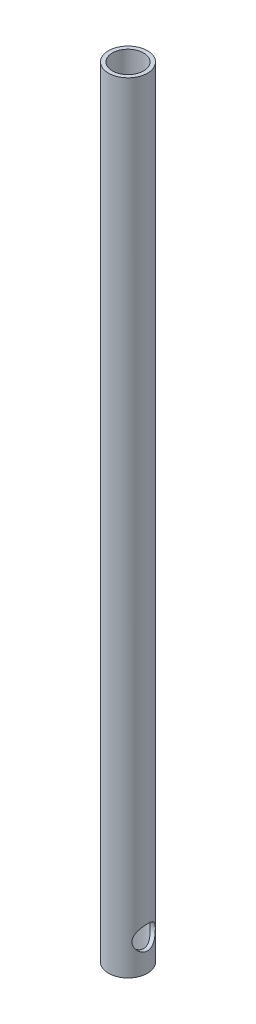
ISO-10303-21;
HEADER;
FILE_DESCRIPTION(('STEP AP214'),'2;1');
FILE_NAME('part.step','',(''),(''),'','','');
FILE_SCHEMA(('AUTOMOTIVE_DESIGN { 1 0 10303 214 1 1 1 1 }'));
ENDSEC;
DATA;
#1=APPLICATION_CONTEXT('core data for automotive mechanical design processes');
#2=APPLICATION_PROTOCOL_DEFINITION('international standard','automotive_design',2000,#1);
#3=PRODUCT_CONTEXT('',#1,'mechanical');
#4=PRODUCT('Part','Part','',(#3));
#5=PRODUCT_RELATED_PRODUCT_CATEGORY('part','',(#4));
#6=PRODUCT_DEFINITION_FORMATION('','',#4);
#7=PRODUCT_DEFINITION_CONTEXT('part definition',#1,'design');
#8=PRODUCT_DEFINITION('design','',#6,#7);
#9=PRODUCT_DEFINITION_SHAPE('','',#8);
#10=(LENGTH_UNIT() NAMED_UNIT(*) SI_UNIT(.MILLI.,.METRE.));
#11=(NAMED_UNIT(*) PLANE_ANGLE_UNIT() SI_UNIT($,.RADIAN.));
#12=(NAMED_UNIT(*) SI_UNIT($,.STERADIAN.) SOLID_ANGLE_UNIT());
#13=UNCERTAINTY_MEASURE_WITH_UNIT(LENGTH_MEASURE(1.E-05),#10,'distance_accuracy_value','');
#14=(GEOMETRIC_REPRESENTATION_CONTEXT(3) GLOBAL_UNCERTAINTY_ASSIGNED_CONTEXT((#13)) GLOBAL_UNIT_ASSIGNED_CONTEXT((#10,
#11,#12)) REPRESENTATION_CONTEXT('',''));
#15=CARTESIAN_POINT('',(0.,0.,0.));
#16=DIRECTION('',(0.,0.,1.));
#17=DIRECTION('',(1.,0.,0.));
#18=AXIS2_PLACEMENT_3D('',#15,#16,#17);
#19=CARTESIAN_POINT('',(0.,100.,0.));
#20=DIRECTION('',(0.,-1.,0.));
#21=DIRECTION('',(0.,0.,-1.));
#22=AXIS2_PLACEMENT_3D('',#19,#20,#21);
#23=CYLINDRICAL_SURFACE('',#22,2.5);
#24=CARTESIAN_POINT('',(0.,100.,0.));
#25=DIRECTION('',(0.,1.,0.));
#26=DIRECTION('',(0.,0.,1.));
#27=AXIS2_PLACEMENT_3D('',#24,#25,#26);
#28=CIRCLE('',#27,2.5);
#29=CARTESIAN_POINT('',(0.,100.,2.5));
#30=VERTEX_POINT('',#29);
#31=EDGE_CURVE('E10',#30,#30,#28,.T.);
#32=ORIENTED_EDGE('',*,*,#31,.F.);
#33=EDGE_LOOP('',(#32));
#34=FACE_BOUND('',#33,.T.);
#35=CARTESIAN_POINT('',(0.,0.,0.));
#36=DIRECTION('',(0.,1.,0.));
#37=DIRECTION('',(0.,0.,1.));
#38=AXIS2_PLACEMENT_3D('',#35,#36,#37);
#39=CIRCLE('',#38,2.5);
#40=CARTESIAN_POINT('',(0.,0.,2.5));
#41=VERTEX_POINT('',#40);
#42=EDGE_CURVE('E53',#41,#41,#39,.T.);
#43=ORIENTED_EDGE('',*,*,#42,.T.);
#44=EDGE_LOOP('',(#43));
#45=FACE_BOUND('',#44,.T.);
#46=CARTESIAN_POINT('',(-2.,4.,1.5));
#47=CARTESIAN_POINT('',(-1.99999416642511,4.07547897528964,1.50000404108592));
#48=CARTESIAN_POINT('',(-2.00433633903481,4.1509384340798,1.49426852824014));
#49=CARTESIAN_POINT('',(-2.02092590613883,4.29932390396222,1.47174965152787));
#50=CARTESIAN_POINT('',(-2.03318155043097,4.3722471873851,1.45495475788936));
#51=CARTESIAN_POINT('',(-2.0636233903473,4.51308364167728,1.41143486335795));
#52=CARTESIAN_POINT('',(-2.08176666183119,4.58102883803527,1.3847815450315));
#53=CARTESIAN_POINT('',(-2.12185904995836,4.71143745336792,1.32252909283019));
#54=CARTESIAN_POINT('',(-2.14380930122416,4.77389922969514,1.28692729054693));
#55=CARTESIAN_POINT('',(-2.19228594587542,4.89994901666408,1.20271292747644));
#56=CARTESIAN_POINT('',(-2.21904371037662,4.96274095712394,1.15304179435289));
#57=CARTESIAN_POINT('',(-2.2722622943106,5.07976476274175,1.04426801309985));
#58=CARTESIAN_POINT('',(-2.29872287517103,5.1339901516708,0.985158296729613));
#59=CARTESIAN_POINT('',(-2.35175567858734,5.2381338097097,0.851442367411702));
#60=CARTESIAN_POINT('',(-2.37803133577818,5.28695446366975,0.775851995162548));
#61=CARTESIAN_POINT('',(-2.42443786983179,5.37080972244443,0.615654228271658));
#62=CARTESIAN_POINT('',(-2.44457437988735,5.40585697412271,0.53105519662633));
#63=CARTESIAN_POINT('',(-2.4747098780044,5.45759592281265,0.363771406742666));
#64=CARTESIAN_POINT('',(-2.4854930393917,5.4757203609673,0.281674698130915));
#65=CARTESIAN_POINT('',(-2.49874939277545,5.49794280286312,0.114970509382708));
#66=CARTESIAN_POINT('',(-2.50123038813307,5.50205397800006,0.0303654624001535));
#67=CARTESIAN_POINT('',(-2.49783372711539,5.49638625265754,-0.12763728373731));
#68=CARTESIAN_POINT('',(-2.49295437513726,5.48826647383069,-0.201123832865635));
#69=CARTESIAN_POINT('',(-2.47707997553857,5.46152020435189,-0.345464269151768));
#70=CARTESIAN_POINT('',(-2.46608447529309,5.44289293609285,-0.416317961051202));
#71=CARTESIAN_POINT('',(-2.43884907201719,5.39583443729622,-0.554056780469079));
#72=CARTESIAN_POINT('',(-2.42257910450824,5.367346938861,-0.620916491037617));
#73=CARTESIAN_POINT('',(-2.38609637638748,5.30161538377446,-0.74898866011561));
#74=CARTESIAN_POINT('',(-2.36588259201812,5.26436905294099,-0.810199646208011));
#75=CARTESIAN_POINT('',(-2.32037925976363,5.17716090719555,-0.933074267143199));
#76=CARTESIAN_POINT('',(-2.2947718295215,5.12621168826426,-0.993918663198193));
#77=CARTESIAN_POINT('',(-2.24255554245601,5.01559588213983,-1.10671465909275));
#78=CARTESIAN_POINT('',(-2.21594536703375,4.95591749652549,-1.1586540130834));
#79=CARTESIAN_POINT('',(-2.16111075123946,4.82134659383645,-1.25824837767417));
#80=CARTESIAN_POINT('',(-2.13305661385124,4.74549242346054,-1.30470933188632));
#81=CARTESIAN_POINT('',(-2.08250879557267,4.58529376836339,-1.38397217194232));
#82=CARTESIAN_POINT('',(-2.0600049029882,4.50096528387436,-1.41679921962189));
#83=CARTESIAN_POINT('',(-2.02895865196731,4.34760636810465,-1.46077497064842));
#84=CARTESIAN_POINT('',(-2.01833888618315,4.27995936770336,-1.47527903312665));
#85=CARTESIAN_POINT('',(-2.00392150777558,4.14262638970052,-1.49480872755284));
#86=CARTESIAN_POINT('',(-2.00011596115116,4.07294287951544,-1.49984538302907));
#87=CARTESIAN_POINT('',(-1.99988914321323,3.93344831756429,-1.50014781114183));
#88=CARTESIAN_POINT('',(-2.00347810223984,3.86363722278479,-1.49540004697659));
#89=CARTESIAN_POINT('',(-2.01751520788652,3.72601265625144,-1.47640290574941));
#90=CARTESIAN_POINT('',(-2.02796877613213,3.65820080775975,-1.46214601830139));
#91=CARTESIAN_POINT('',(-2.054317683331,3.52628542052022,-1.42488312618657));
#92=CARTESIAN_POINT('',(-2.07020622092812,3.46217736346777,-1.40188805257362));
#93=CARTESIAN_POINT('',(-2.10571539417587,3.33852228426982,-1.34796261057072));
#94=CARTESIAN_POINT('',(-2.12533743689999,3.278976993634,-1.31702924888212));
#95=CARTESIAN_POINT('',(-2.17036819177736,3.15475991748776,-1.24167439558512));
#96=CARTESIAN_POINT('',(-2.19618239397369,3.09109916490343,-1.19582663060303));
#97=CARTESIAN_POINT('',(-2.2482175480362,2.97171451515054,-1.09487395518701));
#98=CARTESIAN_POINT('',(-2.27443886711455,2.91599830783089,-1.03976018672402));
#99=CARTESIAN_POINT('',(-2.32835625910913,2.80677599264957,-0.913274837212769));
#100=CARTESIAN_POINT('',(-2.3558007587587,2.75449927339416,-0.840721108780194));
#101=CARTESIAN_POINT('',(-2.40537639133459,2.66309722316335,-0.686103100868023));
#102=CARTESIAN_POINT('',(-2.4275110444941,2.62396317215908,-0.604045176134705));
#103=CARTESIAN_POINT('',(-2.46252280092775,2.56313179656863,-0.438840232972141));
#104=CARTESIAN_POINT('',(-2.47595588067329,2.54037377220889,-0.356205963651261));
#105=CARTESIAN_POINT('',(-2.494407389061,2.50928539715374,-0.18738306389086));
#106=CARTESIAN_POINT('',(-2.49943534582737,2.50093870928238,-0.101198571781971));
#107=CARTESIAN_POINT('',(-2.50040600461976,2.49932539141407,0.0598120232009817));
#108=CARTESIAN_POINT('',(-2.49747057186327,2.50419666543697,0.134620583589704));
#109=CARTESIAN_POINT('',(-2.48512948412095,2.52489382438161,0.282148755978772));
#110=CARTESIAN_POINT('',(-2.47572375706639,2.5407198313216,0.354868344701912));
#111=CARTESIAN_POINT('',(-2.45149427526962,2.58221957158378,0.495145481978795));
#112=CARTESIAN_POINT('',(-2.43675966858906,2.60773159612924,0.562767032608828));
#113=CARTESIAN_POINT('',(-2.40303337447155,2.66764059455475,0.692781971999982));
#114=CARTESIAN_POINT('',(-2.38404073252268,2.7020395608596,0.75517418419983));
#115=CARTESIAN_POINT('',(-2.34093432659381,2.78292519656876,0.880263645295945));
#116=CARTESIAN_POINT('',(-2.31648844639149,2.83031870901687,0.942258690439938));
#117=CARTESIAN_POINT('',(-2.26601907350661,2.93375303371772,1.05789751536306));
#118=CARTESIAN_POINT('',(-2.23999385274509,2.98980342560791,1.11153190956915));
#119=CARTESIAN_POINT('',(-2.18528165666204,3.1172855621777,1.2159097535057));
#120=CARTESIAN_POINT('',(-2.15667566270901,3.1897664861655,1.26542406663367));
#121=CARTESIAN_POINT('',(-2.10376464485145,3.34348485276654,1.35156817210325));
#122=CARTESIAN_POINT('',(-2.07945738811052,3.42471771398141,1.38820466322661));
#123=CARTESIAN_POINT('',(-2.0408000304796,3.5870642851372,1.44437116535132));
#124=CARTESIAN_POINT('',(-2.02577665830138,3.66759523596124,1.46509526060187));
#125=CARTESIAN_POINT('',(-2.00539032320036,3.83209739470368,1.49289268240426));
#126=CARTESIAN_POINT('',(-2.00000648744643,3.91606076575871,1.49999550595837));
#127=CARTESIAN_POINT('',(-2.,4.,1.5));
#128=B_SPLINE_CURVE_WITH_KNOTS('',3,(#46,#47,#48,#49,#50,#51,#52,#53,#54,#55,#56,#57,#58,#59,
#60,#61,#62,#63,#64,#65,#66,#67,#68,#69,#70,#71,#72,#73,#74,#75,#76,#77,#78,#79,#80,#81,#82,#83,
#84,#85,#86,#87,#88,#89,#90,#91,#92,#93,#94,#95,#96,#97,#98,#99,#100,#101,#102,#103,#104,#105,
#106,#107,#108,#109,#110,#111,#112,#113,#114,#115,#116,#117,#118,#119,#120,#121,#122,#123,#124,
#125,#126,#127),.UNSPECIFIED.,.T.,.F.,(4,2,2,2,2,2,2,2,2,2,2,2,2,2,2,2,2,2,2,2,2,2,2,2,2,2,2,2,
2,2,2,2,2,2,2,2,2,2,2,2,4),(0.,0.226085249493392,0.45240657433077,0.677113624991876,
0.901887762215932,1.15414462390001,1.40659128601844,1.68630157736223,1.9657544327122,
2.21853330858497,2.47107452602766,2.69230130543182,2.91354445887944,3.13607155036377,
3.35865648368878,3.60782810055849,3.85733966656908,4.13576671140276,4.41367760154768,
4.62276298054684,4.83160475643976,5.04073566011181,5.25003193304128,5.45906724365495,
5.6681814915466,5.91499438482002,6.16204457978454,6.44121828011588,6.72020638384847,
6.97891479383337,7.23732973022726,7.46129321849399,7.68525920139648,7.90563970188756,
8.12606965394584,8.37042963549487,8.61506198741954,8.89071695766603,9.16622832484805,
9.41820120134354,9.66962780912277),.UNSPECIFIED.);
#129=CARTESIAN_POINT('',(-2.,4.,1.5));
#130=VERTEX_POINT('',#129);
#131=EDGE_CURVE('E83',#130,#130,#128,.T.);
#132=ORIENTED_EDGE('',*,*,#131,.F.);
#133=EDGE_LOOP('',(#132));
#134=FACE_BOUND('',#133,.T.);
#135=CARTESIAN_POINT('',(2.,4.,1.5));
#136=CARTESIAN_POINT('',(1.99999416642511,3.92452102471036,1.50000404108592));
#137=CARTESIAN_POINT('',(2.00433633903481,3.8490615659202,1.49426852824013));
#138=CARTESIAN_POINT('',(2.02092590613883,3.70067609603778,1.47174965152787));
#139=CARTESIAN_POINT('',(2.03318155043097,3.6277528126149,1.45495475788936));
#140=CARTESIAN_POINT('',(2.0636233903473,3.48691635832272,1.41143486335795));
#141=CARTESIAN_POINT('',(2.08176666183119,3.41897116196473,1.3847815450315));
#142=CARTESIAN_POINT('',(2.12185904995836,3.28856254663208,1.32252909283019));
#143=CARTESIAN_POINT('',(2.14380930122416,3.22610077030486,1.28692729054693));
#144=CARTESIAN_POINT('',(2.19228594587542,3.10005098333592,1.20271292747644));
#145=CARTESIAN_POINT('',(2.21904371037662,3.03725904287606,1.15304179435289));
#146=CARTESIAN_POINT('',(2.27226229431061,2.92023523725825,1.04426801309985));
#147=CARTESIAN_POINT('',(2.29872287517103,2.8660098483292,0.985158296729613));
#148=CARTESIAN_POINT('',(2.35175567858734,2.7618661902903,0.851442367411701));
#149=CARTESIAN_POINT('',(2.37803133577818,2.71304553633025,0.775851995162548));
#150=CARTESIAN_POINT('',(2.42443786983179,2.62919027755557,0.615654228271658));
#151=CARTESIAN_POINT('',(2.44457437988735,2.59414302587729,0.53105519662633));
#152=CARTESIAN_POINT('',(2.4747098780044,2.54240407718735,0.363771406742666));
#153=CARTESIAN_POINT('',(2.4854930393917,2.5242796390327,0.281674698130915));
#154=CARTESIAN_POINT('',(2.49874939277545,2.50205719713688,0.114970509382708));
#155=CARTESIAN_POINT('',(2.50123038813307,2.49794602199995,0.0303654624001528));
#156=CARTESIAN_POINT('',(2.49783372711539,2.50361374734246,-0.12763728373731));
#157=CARTESIAN_POINT('',(2.49295437513726,2.51173352616931,-0.201123832865635));
#158=CARTESIAN_POINT('',(2.47707997553857,2.53847979564811,-0.345464269151768));
#159=CARTESIAN_POINT('',(2.46608447529309,2.55710706390716,-0.416317961051202));
#160=CARTESIAN_POINT('',(2.43884907201719,2.60416556270378,-0.55405678046908));
#161=CARTESIAN_POINT('',(2.42257910450824,2.632653061139,-0.620916491037618));
#162=CARTESIAN_POINT('',(2.38609637638748,2.69838461622554,-0.748988660115612));
#163=CARTESIAN_POINT('',(2.36588259201812,2.73563094705901,-0.810199646208012));
#164=CARTESIAN_POINT('',(2.32037925976362,2.82283909280445,-0.9330742671432));
#165=CARTESIAN_POINT('',(2.2947718295215,2.87378831173574,-0.993918663198194));
#166=CARTESIAN_POINT('',(2.24255554245601,2.98440411786018,-1.10671465909275));
#167=CARTESIAN_POINT('',(2.21594536703375,3.04408250347451,-1.1586540130834));
#168=CARTESIAN_POINT('',(2.16111075123946,3.17865340616355,-1.25824837767417));
#169=CARTESIAN_POINT('',(2.13305661385124,3.25450757653946,-1.30470933188632));
#170=CARTESIAN_POINT('',(2.08250879557267,3.41470623163661,-1.38397217194232));
#171=CARTESIAN_POINT('',(2.0600049029882,3.49903471612564,-1.41679921962189));
#172=CARTESIAN_POINT('',(2.02895865196731,3.65239363189535,-1.46077497064842));
#173=CARTESIAN_POINT('',(2.01833888618315,3.72004063229664,-1.47527903312665));
#174=CARTESIAN_POINT('',(2.00392150777558,3.85737361029948,-1.49480872755284));
#175=CARTESIAN_POINT('',(2.00011596115116,3.92705712048456,-1.49984538302907));
#176=CARTESIAN_POINT('',(1.99988914321323,4.06655168243571,-1.50014781114183));
#177=CARTESIAN_POINT('',(2.00347810223984,4.13636277721521,-1.49540004697659));
#178=CARTESIAN_POINT('',(2.01751520788652,4.27398734374856,-1.47640290574941));
#179=CARTESIAN_POINT('',(2.02796877613213,4.34179919224025,-1.46214601830139));
#180=CARTESIAN_POINT('',(2.054317683331,4.47371457947979,-1.42488312618657));
#181=CARTESIAN_POINT('',(2.07020622092812,4.53782263653223,-1.40188805257362));
#182=CARTESIAN_POINT('',(2.10571539417587,4.66147771573018,-1.34796261057072));
#183=CARTESIAN_POINT('',(2.12533743689999,4.721023006366,-1.31702924888212));
#184=CARTESIAN_POINT('',(2.17036819177736,4.84524008251225,-1.24167439558512));
#185=CARTESIAN_POINT('',(2.19618239397369,4.90890083509657,-1.19582663060303));
#186=CARTESIAN_POINT('',(2.2482175480362,5.02828548484946,-1.09487395518701));
#187=CARTESIAN_POINT('',(2.27443886711455,5.08400169216912,-1.03976018672402));
#188=CARTESIAN_POINT('',(2.32835625910913,5.19322400735043,-0.913274837212767));
#189=CARTESIAN_POINT('',(2.3558007587587,5.24550072660584,-0.840721108780192));
#190=CARTESIAN_POINT('',(2.40537639133459,5.33690277683665,-0.68610310086802));
#191=CARTESIAN_POINT('',(2.4275110444941,5.37603682784092,-0.604045176134704));
#192=CARTESIAN_POINT('',(2.46252280092775,5.43686820343137,-0.43884023297214));
#193=CARTESIAN_POINT('',(2.47595588067329,5.45962622779111,-0.356205963651259));
#194=CARTESIAN_POINT('',(2.494407389061,5.49071460284626,-0.187383063890858));
#195=CARTESIAN_POINT('',(2.49943534582737,5.49906129071762,-0.101198571781969));
#196=CARTESIAN_POINT('',(2.50040600461976,5.50067460858593,0.0598120232009833));
#197=CARTESIAN_POINT('',(2.49747057186327,5.49580333456303,0.134620583589705));
#198=CARTESIAN_POINT('',(2.48512948412095,5.47510617561839,0.282148755978773));
#199=CARTESIAN_POINT('',(2.47572375706639,5.4592801686784,0.354868344701913));
#200=CARTESIAN_POINT('',(2.45149427526962,5.41778042841621,0.495145481978796));
#201=CARTESIAN_POINT('',(2.43675966858906,5.39226840387076,0.562767032608829));
#202=CARTESIAN_POINT('',(2.40303337447155,5.33235940544525,0.692781971999983));
#203=CARTESIAN_POINT('',(2.38404073252268,5.2979604391404,0.755174184199831));
#204=CARTESIAN_POINT('',(2.3409343265938,5.21707480343124,0.880263645295947));
#205=CARTESIAN_POINT('',(2.31648844639149,5.16968129098313,0.942258690439939));
#206=CARTESIAN_POINT('',(2.26601907350661,5.06624696628228,1.05789751536307));
#207=CARTESIAN_POINT('',(2.23999385274509,5.01019657439209,1.11153190956916));
#208=CARTESIAN_POINT('',(2.18528165666204,4.8827144378223,1.2159097535057));
#209=CARTESIAN_POINT('',(2.15667566270901,4.8102335138345,1.26542406663367));
#210=CARTESIAN_POINT('',(2.10376464485145,4.65651514723346,1.35156817210325));
#211=CARTESIAN_POINT('',(2.07945738811052,4.57528228601859,1.38820466322661));
#212=CARTESIAN_POINT('',(2.0408000304796,4.4129357148628,1.44437116535132));
#213=CARTESIAN_POINT('',(2.02577665830138,4.33240476403875,1.46509526060187));
#214=CARTESIAN_POINT('',(2.00539032320036,4.16790260529632,1.49289268240426));
#215=CARTESIAN_POINT('',(2.00000648744643,4.08393923424129,1.49999550595837));
#216=CARTESIAN_POINT('',(2.,4.,1.5));
#217=B_SPLINE_CURVE_WITH_KNOTS('',3,(#135,#136,#137,#138,#139,#140,#141,#142,#143,#144,#145,
#146,#147,#148,#149,#150,#151,#152,#153,#154,#155,#156,#157,#158,#159,#160,#161,#162,#163,#164,
#165,#166,#167,#168,#169,#170,#171,#172,#173,#174,#175,#176,#177,#178,#179,#180,#181,#182,#183,
#184,#185,#186,#187,#188,#189,#190,#191,#192,#193,#194,#195,#196,#197,#198,#199,#200,#201,#202,
#203,#204,#205,#206,#207,#208,#209,#210,#211,#212,#213,#214,#215,#216),.UNSPECIFIED.,.T.,.F.,(4,
2,2,2,2,2,2,2,2,2,2,2,2,2,2,2,2,2,2,2,2,2,2,2,2,2,2,2,2,2,2,2,2,2,2,2,2,2,2,2,4),(0.,
0.226085249493392,0.45240657433077,0.677113624991876,0.901887762215933,1.15414462390001,
1.40659128601844,1.68630157736223,1.9657544327122,2.21853330858497,2.47107452602767,
2.69230130543182,2.91354445887945,3.13607155036377,3.35865648368878,3.60782810055849,
3.85733966656908,4.13576671140276,4.41367760154768,4.62276298054684,4.83160475643976,
5.04073566011181,5.25003193304128,5.45906724365495,5.66818149154661,5.91499438482002,
6.16204457978454,6.44121828011588,6.72020638384847,6.97891479383337,7.23732973022726,
7.46129321849399,7.68525920139648,7.90563970188756,8.12606965394584,8.37042963549487,
8.61506198741955,8.89071695766604,9.16622832484805,9.41820120134354,9.66962780912277),.UNSPECIFIED.);
#218=CARTESIAN_POINT('',(2.,4.,1.5));
#219=VERTEX_POINT('',#218);
#220=EDGE_CURVE('E89',#219,#219,#217,.T.);
#221=ORIENTED_EDGE('',*,*,#220,.F.);
#222=EDGE_LOOP('',(#221));
#223=FACE_BOUND('',#222,.T.);
#224=ADVANCED_FACE('F39',(#34,#45,#134,#223),#23,.T.);
#225=CARTESIAN_POINT('',(0.,100.,0.));
#226=DIRECTION('',(0.,-1.,0.));
#227=DIRECTION('',(0.,0.,-1.));
#228=AXIS2_PLACEMENT_3D('',#225,#226,#227);
#229=CYLINDRICAL_SURFACE('',#228,2.);
#230=CARTESIAN_POINT('',(-1.32287565553229,4.,1.5));
#231=CARTESIAN_POINT('',(-1.32289190044095,4.06999742342563,1.49999219049447));
#232=CARTESIAN_POINT('',(-1.32856366615417,4.14004583431192,1.4950410907442));
#233=CARTESIAN_POINT('',(-1.34990644032801,4.27732985620948,1.47578333210409));
#234=CARTESIAN_POINT('',(-1.3656072516867,4.34455644501951,1.46144878565587));
#235=CARTESIAN_POINT('',(-1.4037512791687,4.47357984673838,1.42483838991846));
#236=CARTESIAN_POINT('',(-1.42609848244814,4.53543877676246,1.40267483444956));
#237=CARTESIAN_POINT('',(-1.47486455031267,4.65434545444519,1.35130655299363));
#238=CARTESIAN_POINT('',(-1.50128292264932,4.71139378246922,1.3221026780169));
#239=CARTESIAN_POINT('',(-1.56177312961147,4.83211279631659,1.25039909811054));
#240=CARTESIAN_POINT('',(-1.59628904009787,4.89466793422648,1.20639573950363));
#241=CARTESIAN_POINT('',(-1.66521164096378,5.01252546624227,1.10933596759308));
#242=CARTESIAN_POINT('',(-1.69961809339876,5.06781696482027,1.05626622282799));
#243=CARTESIAN_POINT('',(-1.77262582436251,5.18085873865547,0.929610192252514));
#244=CARTESIAN_POINT('',(-1.81064921229759,5.23680596671985,0.854047289142163));
#245=CARTESIAN_POINT('',(-1.87882809751632,5.33462220828283,0.69118971482194));
#246=CARTESIAN_POINT('',(-1.90900204180106,5.37652429746881,0.603923293836167));
#247=CARTESIAN_POINT('',(-1.95034258990248,5.43320768590294,0.447869023983645));
#248=CARTESIAN_POINT('',(-1.96449710921006,5.45235709597847,0.381446049692536));
#249=CARTESIAN_POINT('',(-1.98605635937555,5.48139011599675,0.245552609316542));
#250=CARTESIAN_POINT('',(-1.99346695432364,5.49128177610674,0.176084845995169));
#251=CARTESIAN_POINT('',(-2.00091375578087,5.50122173386249,0.0358650926220278));
#252=CARTESIAN_POINT('',(-2.00093080057495,5.50124445437644,-0.0348897591186389));
#253=CARTESIAN_POINT('',(-1.99354206503066,5.49138206321971,-0.175316156674036));
#254=CARTESIAN_POINT('',(-1.98613456571337,5.48149465709186,-0.244987447822227));
#255=CARTESIAN_POINT('',(-1.96491377944411,5.45291894941013,-0.378889193792651));
#256=CARTESIAN_POINT('',(-1.9513285776568,5.43454367361293,-0.443224268236295));
#257=CARTESIAN_POINT('',(-1.91882278657017,5.39000435781776,-0.567680485046397));
#258=CARTESIAN_POINT('',(-1.89990103394193,5.36383861948684,-0.627800705033636));
#259=CARTESIAN_POINT('',(-1.85561045984504,5.30147038485469,-0.74921692186473));
#260=CARTESIAN_POINT('',(-1.82976540608097,5.26448790338124,-0.809935384713599));
#261=CARTESIAN_POINT('',(-1.77460702483739,5.18326629602949,-0.924567250548284));
#262=CARTESIAN_POINT('',(-1.74529074780453,5.1390209863001,-0.978474784621221));
#263=CARTESIAN_POINT('',(-1.6789376587236,5.03477665117906,-1.08908204283329));
#264=CARTESIAN_POINT('',(-1.64151655866368,4.9733907899736,-1.14424493004784));
#265=CARTESIAN_POINT('',(-1.5672595828377,4.84216541637806,-1.24400875556228));
#266=CARTESIAN_POINT('',(-1.53042399363524,4.77232190047494,-1.28860466211477));
#267=CARTESIAN_POINT('',(-1.46819425999159,4.63901812975437,-1.358732064116));
#268=CARTESIAN_POINT('',(-1.44197599789983,4.57701295469935,-1.38628866868102));
#269=CARTESIAN_POINT('',(-1.39536741257394,4.44793471858062,-1.43319397108784));
#270=CARTESIAN_POINT('',(-1.37496395320511,4.38087352030963,-1.45256121808259));
#271=CARTESIAN_POINT('',(-1.34640050620232,4.25631305600168,-1.47902385350669));
#272=CARTESIAN_POINT('',(-1.3366153955687,4.19955291788314,-1.48779069496582));
#273=CARTESIAN_POINT('',(-1.32435588438334,4.08464453382618,-1.49871760619789));
#274=CARTESIAN_POINT('',(-1.32187213058307,4.02649816009718,-1.50088612873265));
#275=CARTESIAN_POINT('',(-1.32462868790497,3.9105210082666,-1.49845270115552));
#276=CARTESIAN_POINT('',(-1.32987184207164,3.85269035419033,-1.4938482589949));
#277=CARTESIAN_POINT('',(-1.34721218775046,3.73892384755713,-1.47822527271969));
#278=CARTESIAN_POINT('',(-1.35932107727345,3.6829914020519,-1.46719578056394));
#279=CARTESIAN_POINT('',(-1.39427758287802,3.55366195506113,-1.43413959562387));
#280=CARTESIAN_POINT('',(-1.41944823697315,3.48156404608497,-1.40954189769242));
#281=CARTESIAN_POINT('',(-1.47537861079975,3.34369233635989,-1.35088877838435));
#282=CARTESIAN_POINT('',(-1.5061485847723,3.27793048270525,-1.31681594335477));
#283=CARTESIAN_POINT('',(-1.5710828237565,3.15065099195188,-1.23869774116696));
#284=CARTESIAN_POINT('',(-1.60532883846046,3.08936712378175,-1.19434110060341));
#285=CARTESIAN_POINT('',(-1.67347506272361,2.97399790363875,-1.09682562914592));
#286=CARTESIAN_POINT('',(-1.70737509574665,2.91991607201106,-1.04366252194463));
#287=CARTESIAN_POINT('',(-1.77960222623532,2.80872300837064,-0.916234513829622));
#288=CARTESIAN_POINT('',(-1.81728174165357,2.7535247611424,-0.839896270946857));
#289=CARTESIAN_POINT('',(-1.88453104769825,2.65737926654913,-0.675551612651268));
#290=CARTESIAN_POINT('',(-1.91411836052283,2.61640117541871,-0.587571029974852));
#291=CARTESIAN_POINT('',(-1.95419406402379,2.56156200855313,-0.430755661496912));
#292=CARTESIAN_POINT('',(-1.9677547802964,2.54324320672456,-0.364250057327473));
#293=CARTESIAN_POINT('',(-1.98810265589123,2.51587120369248,-0.228364464964353));
#294=CARTESIAN_POINT('',(-1.9948958710696,2.50680971845149,-0.158987104561944));
#295=CARTESIAN_POINT('',(-2.00113566717062,2.4984836090714,-0.0191476059403998));
#296=CARTESIAN_POINT('',(-2.00056500218907,2.49924198265175,0.0513166925870866));
#297=CARTESIAN_POINT('',(-1.9920880324381,2.51056099130124,0.19100901103008));
#298=CARTESIAN_POINT('',(-1.98417977344351,2.52112423770748,0.260236696591288));
#299=CARTESIAN_POINT('',(-1.96203400925195,2.55097491616724,0.393521935254971));
#300=CARTESIAN_POINT('',(-1.94798690792879,2.57000018132155,0.457671236511441));
#301=CARTESIAN_POINT('',(-1.91462720575136,2.61578806561894,0.581661343097388));
#302=CARTESIAN_POINT('',(-1.89531347862386,2.64255233983091,0.641501223388814));
#303=CARTESIAN_POINT('',(-1.8501764221064,2.70627793759597,0.762547698766811));
#304=CARTESIAN_POINT('',(-1.82386352707581,2.74405093135959,0.823141236713417));
#305=CARTESIAN_POINT('',(-1.76785506075717,2.82686644055421,0.937414811724213));
#306=CARTESIAN_POINT('',(-1.73815638795658,2.87191563728605,0.991088412383372));
#307=CARTESIAN_POINT('',(-1.67106353042106,2.97800536656079,1.10112380660681));
#308=CARTESIAN_POINT('',(-1.63330922504697,3.0404463994399,1.15591691541995));
#309=CARTESIAN_POINT('',(-1.55866082463332,3.17386807189987,1.2547525342935));
#310=CARTESIAN_POINT('',(-1.52176704921892,3.24485182603656,1.29879110556728));
#311=CARTESIAN_POINT('',(-1.46049601449284,3.37888325059031,1.36695971301455));
#312=CARTESIAN_POINT('',(-1.43513625007637,3.44033498270656,1.39333526337998));
#313=CARTESIAN_POINT('',(-1.39032564651233,3.56808291305588,1.43805398028599));
#314=CARTESIAN_POINT('',(-1.37085915899696,3.63436569159545,1.45641847678344));
#315=CARTESIAN_POINT('',(-1.34532423383262,3.75078821959693,1.4799705775638));
#316=CARTESIAN_POINT('',(-1.33700130265679,3.79996707129046,1.48744249026867));
#317=CARTESIAN_POINT('',(-1.32577295392455,3.89942233303365,1.49745839072448));
#318=CARTESIAN_POINT('',(-1.32286398151145,3.94969800094373,1.50000561211714));
#319=CARTESIAN_POINT('',(-1.32287565553229,4.,1.5));
#320=B_SPLINE_CURVE_WITH_KNOTS('',3,(#230,#231,#232,#233,#234,#235,#236,#237,#238,#239,#240,
#241,#242,#243,#244,#245,#246,#247,#248,#249,#250,#251,#252,#253,#254,#255,#256,#257,#258,#259,
#260,#261,#262,#263,#264,#265,#266,#267,#268,#269,#270,#271,#272,#273,#274,#275,#276,#277,#278,
#279,#280,#281,#282,#283,#284,#285,#286,#287,#288,#289,#290,#291,#292,#293,#294,#295,#296,#297,
#298,#299,#300,#301,#302,#303,#304,#305,#306,#307,#308,#309,#310,#311,#312,#313,#314,#315,#316,
#317,#318,#319),.UNSPECIFIED.,.T.,.F.,(4,2,2,2,2,2,2,2,2,2,2,2,2,2,2,2,2,2,2,2,2,2,2,2,2,2,2,2,
2,2,2,2,2,2,2,2,2,2,2,2,2,2,2,2,4),(0.,0.20973177668449,0.420089722582994,0.627545385620138,
0.834975984672344,1.08585208691169,1.33710031031849,1.63964848103538,1.94147907444963,
2.15227725277555,2.36289195870711,2.57405250727807,2.78526195641288,2.9892375589505,
3.19325766108669,3.41936844116895,3.64567274887663,3.91649517204702,4.18744629647933,
4.40499409477196,4.62204646613006,4.79608005545901,4.96989060538193,5.14376512326213,
5.31793678696019,5.55730028202397,5.79710662639151,6.0454320909006,6.29387849446618,
6.59652499511463,6.89851088586565,7.10852896194427,7.3183589353918,7.52868041101043,
7.73905791773945,7.94332812691912,8.14764205379332,8.3751005248961,8.60276905744644,
8.87547580578155,9.14828228208531,9.36218279640835,9.57551025772699,9.72632812073766,
9.87704692032409),.UNSPECIFIED.);
#321=CARTESIAN_POINT('',(-1.32287565553229,4.,1.5));
#322=VERTEX_POINT('',#321);
#323=EDGE_CURVE('E64',#322,#322,#320,.T.);
#324=ORIENTED_EDGE('',*,*,#323,.T.);
#325=EDGE_LOOP('',(#324));
#326=FACE_BOUND('',#325,.T.);
#327=CARTESIAN_POINT('',(0.,100.,0.));
#328=DIRECTION('',(0.,1.,0.));
#329=DIRECTION('',(0.,0.,1.));
#330=AXIS2_PLACEMENT_3D('',#327,#328,#329);
#331=CIRCLE('',#330,2.);
#332=CARTESIAN_POINT('',(0.,100.,2.));
#333=VERTEX_POINT('',#332);
#334=EDGE_CURVE('E59',#333,#333,#331,.T.);
#335=ORIENTED_EDGE('',*,*,#334,.T.);
#336=EDGE_LOOP('',(#335));
#337=FACE_BOUND('',#336,.T.);
#338=CARTESIAN_POINT('',(0.,0.,0.));
#339=DIRECTION('',(0.,1.,0.));
#340=DIRECTION('',(0.,0.,1.));
#341=AXIS2_PLACEMENT_3D('',#338,#339,#340);
#342=CIRCLE('',#341,2.);
#343=CARTESIAN_POINT('',(0.,0.,2.));
#344=VERTEX_POINT('',#343);
#345=EDGE_CURVE('E62',#344,#344,#342,.T.);
#346=ORIENTED_EDGE('',*,*,#345,.F.);
#347=EDGE_LOOP('',(#346));
#348=FACE_BOUND('',#347,.T.);
#349=CARTESIAN_POINT('',(1.32287565553229,4.,1.5));
#350=CARTESIAN_POINT('',(1.32289190044095,3.93000257657437,1.49999219049447));
#351=CARTESIAN_POINT('',(1.32856366615417,3.85995416568808,1.4950410907442));
#352=CARTESIAN_POINT('',(1.34990644032801,3.72267014379052,1.47578333210409));
#353=CARTESIAN_POINT('',(1.3656072516867,3.65544355498049,1.46144878565587));
#354=CARTESIAN_POINT('',(1.4037512791687,3.52642015326162,1.42483838991846));
#355=CARTESIAN_POINT('',(1.42609848244814,3.46456122323754,1.40267483444956));
#356=CARTESIAN_POINT('',(1.47486455031267,3.34565454555481,1.35130655299363));
#357=CARTESIAN_POINT('',(1.50128292264932,3.28860621753078,1.3221026780169));
#358=CARTESIAN_POINT('',(1.56177312961147,3.16788720368341,1.25039909811054));
#359=CARTESIAN_POINT('',(1.59628904009787,3.10533206577352,1.20639573950363));
#360=CARTESIAN_POINT('',(1.66521164096378,2.98747453375773,1.10933596759308));
#361=CARTESIAN_POINT('',(1.69961809339876,2.93218303517973,1.05626622282799));
#362=CARTESIAN_POINT('',(1.77262582436251,2.81914126134453,0.929610192252514));
#363=CARTESIAN_POINT('',(1.81064921229759,2.76319403328014,0.854047289142163));
#364=CARTESIAN_POINT('',(1.87882809751632,2.66537779171716,0.69118971482194));
#365=CARTESIAN_POINT('',(1.90900204180106,2.62347570253119,0.603923293836167));
#366=CARTESIAN_POINT('',(1.95034258990248,2.56679231409706,0.447869023983645));
#367=CARTESIAN_POINT('',(1.96449710921006,2.54764290402153,0.381446049692536));
#368=CARTESIAN_POINT('',(1.98605635937555,2.51860988400325,0.245552609316542));
#369=CARTESIAN_POINT('',(1.99346695432364,2.50871822389326,0.176084845995169));
#370=CARTESIAN_POINT('',(2.00091375578087,2.49877826613751,0.0358650926220276));
#371=CARTESIAN_POINT('',(2.00093080057495,2.49875554562356,-0.034889759118639));
#372=CARTESIAN_POINT('',(1.99354206503066,2.50861793678029,-0.175316156674036));
#373=CARTESIAN_POINT('',(1.98613456571337,2.51850534290814,-0.244987447822227));
#374=CARTESIAN_POINT('',(1.96491377944411,2.54708105058987,-0.378889193792652));
#375=CARTESIAN_POINT('',(1.9513285776568,2.56545632638708,-0.443224268236296));
#376=CARTESIAN_POINT('',(1.91882278657017,2.60999564218224,-0.567680485046397));
#377=CARTESIAN_POINT('',(1.89990103394193,2.63616138051316,-0.627800705033636));
#378=CARTESIAN_POINT('',(1.85561045984504,2.69852961514531,-0.74921692186473));
#379=CARTESIAN_POINT('',(1.82976540608097,2.73551209661876,-0.809935384713599));
#380=CARTESIAN_POINT('',(1.77460702483739,2.81673370397051,-0.924567250548284));
#381=CARTESIAN_POINT('',(1.74529074780453,2.8609790136999,-0.978474784621221));
#382=CARTESIAN_POINT('',(1.6789376587236,2.96522334882094,-1.08908204283329));
#383=CARTESIAN_POINT('',(1.64151655866368,3.0266092100264,-1.14424493004784));
#384=CARTESIAN_POINT('',(1.56725958283769,3.15783458362194,-1.24400875556228));
#385=CARTESIAN_POINT('',(1.53042399363524,3.22767809952506,-1.28860466211477));
#386=CARTESIAN_POINT('',(1.46819425999159,3.36098187024563,-1.358732064116));
#387=CARTESIAN_POINT('',(1.44197599789983,3.42298704530065,-1.38628866868103));
#388=CARTESIAN_POINT('',(1.39536741257394,3.55206528141938,-1.43319397108784));
#389=CARTESIAN_POINT('',(1.37496395320511,3.61912647969037,-1.45256121808259));
#390=CARTESIAN_POINT('',(1.34640050620232,3.74368694399832,-1.47902385350669));
#391=CARTESIAN_POINT('',(1.3366153955687,3.80044708211686,-1.48779069496582));
#392=CARTESIAN_POINT('',(1.32435588438334,3.91535546617382,-1.49871760619789));
#393=CARTESIAN_POINT('',(1.32187213058307,3.97350183990282,-1.50088612873265));
#394=CARTESIAN_POINT('',(1.32462868790497,4.0894789917334,-1.49845270115552));
#395=CARTESIAN_POINT('',(1.32987184207164,4.14730964580967,-1.4938482589949));
#396=CARTESIAN_POINT('',(1.34721218775046,4.26107615244287,-1.47822527271969));
#397=CARTESIAN_POINT('',(1.35932107727345,4.3170085979481,-1.46719578056394));
#398=CARTESIAN_POINT('',(1.39427758287802,4.44633804493887,-1.43413959562387));
#399=CARTESIAN_POINT('',(1.41944823697315,4.51843595391503,-1.40954189769242));
#400=CARTESIAN_POINT('',(1.47537861079976,4.65630766364012,-1.35088877838435));
#401=CARTESIAN_POINT('',(1.5061485847723,4.72206951729475,-1.31681594335477));
#402=CARTESIAN_POINT('',(1.5710828237565,4.84934900804812,-1.23869774116696));
#403=CARTESIAN_POINT('',(1.60532883846046,4.91063287621826,-1.19434110060341));
#404=CARTESIAN_POINT('',(1.67347506272361,5.02600209636125,-1.09682562914592));
#405=CARTESIAN_POINT('',(1.70737509574665,5.08008392798894,-1.04366252194463));
#406=CARTESIAN_POINT('',(1.77960222623533,5.19127699162937,-0.916234513829617));
#407=CARTESIAN_POINT('',(1.81728174165357,5.2464752388576,-0.839896270946853));
#408=CARTESIAN_POINT('',(1.88453104769826,5.34262073345087,-0.675551612651264));
#409=CARTESIAN_POINT('',(1.91411836052283,5.38359882458129,-0.587571029974847));
#410=CARTESIAN_POINT('',(1.9541940640238,5.43843799144687,-0.430755661496907));
#411=CARTESIAN_POINT('',(1.9677547802964,5.45675679327544,-0.364250057327468));
#412=CARTESIAN_POINT('',(1.98810265589123,5.48412879630752,-0.228364464964348));
#413=CARTESIAN_POINT('',(1.9948958710696,5.49319028154851,-0.158987104561939));
#414=CARTESIAN_POINT('',(2.00113566717062,5.5015163909286,-0.0191476059403953));
#415=CARTESIAN_POINT('',(2.00056500218907,5.50075801734824,0.0513166925870906));
#416=CARTESIAN_POINT('',(1.9920880324381,5.48943900869876,0.191009011030084));
#417=CARTESIAN_POINT('',(1.98417977344351,5.47887576229252,0.260236696591292));
#418=CARTESIAN_POINT('',(1.96203400925195,5.44902508383276,0.393521935254975));
#419=CARTESIAN_POINT('',(1.94798690792879,5.42999981867845,0.457671236511445));
#420=CARTESIAN_POINT('',(1.91462720575136,5.38421193438106,0.581661343097392));
#421=CARTESIAN_POINT('',(1.89531347862386,5.35744766016908,0.641501223388818));
#422=CARTESIAN_POINT('',(1.8501764221064,5.29372206240403,0.762547698766815));
#423=CARTESIAN_POINT('',(1.82386352707581,5.25594906864041,0.823141236713421));
#424=CARTESIAN_POINT('',(1.76785506075716,5.17313355944579,0.937414811724218));
#425=CARTESIAN_POINT('',(1.73815638795658,5.12808436271395,0.991088412383376));
#426=CARTESIAN_POINT('',(1.67106353042106,5.0219946334392,1.10112380660681));
#427=CARTESIAN_POINT('',(1.63330922504697,4.95955360056009,1.15591691541996));
#428=CARTESIAN_POINT('',(1.55866082463332,4.82613192810012,1.2547525342935));
#429=CARTESIAN_POINT('',(1.52176704921891,4.75514817396343,1.29879110556729));
#430=CARTESIAN_POINT('',(1.46049601449284,4.62111674940969,1.36695971301455));
#431=CARTESIAN_POINT('',(1.43513625007637,4.55966501729344,1.39333526337998));
#432=CARTESIAN_POINT('',(1.39032564651232,4.43191708694411,1.43805398028599));
#433=CARTESIAN_POINT('',(1.37085915899696,4.36563430840454,1.45641847678344));
#434=CARTESIAN_POINT('',(1.34532423383262,4.24921178040307,1.4799705775638));
#435=CARTESIAN_POINT('',(1.33700130265679,4.20003292870953,1.48744249026867));
#436=CARTESIAN_POINT('',(1.32577295392455,4.10057766696634,1.49745839072448));
#437=CARTESIAN_POINT('',(1.32286398151145,4.05030199905627,1.50000561211714));
#438=CARTESIAN_POINT('',(1.32287565553229,4.,1.5));
#439=B_SPLINE_CURVE_WITH_KNOTS('',3,(#349,#350,#351,#352,#353,#354,#355,#356,#357,#358,#359,
#360,#361,#362,#363,#364,#365,#366,#367,#368,#369,#370,#371,#372,#373,#374,#375,#376,#377,#378,
#379,#380,#381,#382,#383,#384,#385,#386,#387,#388,#389,#390,#391,#392,#393,#394,#395,#396,#397,
#398,#399,#400,#401,#402,#403,#404,#405,#406,#407,#408,#409,#410,#411,#412,#413,#414,#415,#416,
#417,#418,#419,#420,#421,#422,#423,#424,#425,#426,#427,#428,#429,#430,#431,#432,#433,#434,#435,
#436,#437,#438),.UNSPECIFIED.,.T.,.F.,(4,2,2,2,2,2,2,2,2,2,2,2,2,2,2,2,2,2,2,2,2,2,2,2,2,2,2,2,
2,2,2,2,2,2,2,2,2,2,2,2,2,2,2,2,4),(0.,0.20973177668449,0.420089722582994,0.627545385620139,
0.834975984672345,1.08585208691169,1.33710031031849,1.63964848103538,1.94147907444963,
2.15227725277555,2.36289195870711,2.57405250727807,2.78526195641288,2.9892375589505,
3.19325766108669,3.41936844116895,3.64567274887663,3.91649517204702,4.18744629647933,
4.40499409477197,4.62204646613006,4.79608005545901,4.96989060538193,5.14376512326213,
5.31793678696019,5.55730028202398,5.79710662639151,6.0454320909006,6.29387849446618,
6.59652499511463,6.89851088586565,7.10852896194427,7.31835893539181,7.52868041101044,
7.73905791773945,7.94332812691912,8.14764205379333,8.3751005248961,8.60276905744645,
8.87547580578155,9.14828228208531,9.36218279640836,9.57551025772699,9.72632812073766,
9.87704692032409),.UNSPECIFIED.);
#440=CARTESIAN_POINT('',(1.32287565553229,4.,1.5));
#441=VERTEX_POINT('',#440);
#442=EDGE_CURVE('E43',#441,#441,#439,.T.);
#443=ORIENTED_EDGE('',*,*,#442,.T.);
#444=EDGE_LOOP('',(#443));
#445=FACE_BOUND('',#444,.T.);
#446=ADVANCED_FACE('F70',(#326,#337,#348,#445),#229,.F.);
#447=CARTESIAN_POINT('',(0.,100.,0.));
#448=DIRECTION('',(0.,1.,0.));
#449=DIRECTION('',(0.,0.,1.));
#450=AXIS2_PLACEMENT_3D('',#447,#448,#449);
#451=PLANE('',#450);
#452=ORIENTED_EDGE('',*,*,#31,.T.);
#453=EDGE_LOOP('',(#452));
#454=FACE_BOUND('',#453,.T.);
#455=ORIENTED_EDGE('',*,*,#334,.F.);
#456=EDGE_LOOP('',(#455));
#457=FACE_BOUND('',#456,.T.);
#458=ADVANCED_FACE('F107',(#454,#457),#451,.T.);
#459=CARTESIAN_POINT('',(0.,0.,0.));
#460=DIRECTION('',(0.,1.,0.));
#461=DIRECTION('',(0.,0.,1.));
#462=AXIS2_PLACEMENT_3D('',#459,#460,#461);
#463=PLANE('',#462);
#464=ORIENTED_EDGE('',*,*,#42,.F.);
#465=EDGE_LOOP('',(#464));
#466=FACE_BOUND('',#465,.T.);
#467=ORIENTED_EDGE('',*,*,#345,.T.);
#468=EDGE_LOOP('',(#467));
#469=FACE_BOUND('',#468,.T.);
#470=ADVANCED_FACE('F103',(#466,#469),#463,.F.);
#471=CARTESIAN_POINT('',(10.,4.,0.));
#472=DIRECTION('',(-1.,0.,0.));
#473=DIRECTION('',(0.,0.,1.));
#474=AXIS2_PLACEMENT_3D('',#471,#472,#473);
#475=CYLINDRICAL_SURFACE('',#474,1.5);
#476=ORIENTED_EDGE('',*,*,#323,.F.);
#477=EDGE_LOOP('',(#476));
#478=FACE_BOUND('',#477,.T.);
#479=ORIENTED_EDGE('',*,*,#131,.T.);
#480=EDGE_LOOP('',(#479));
#481=FACE_BOUND('',#480,.T.);
#482=ADVANCED_FACE('F76',(#478,#481),#475,.F.);
#483=ORIENTED_EDGE('',*,*,#442,.F.);
#484=EDGE_LOOP('',(#483));
#485=FACE_BOUND('',#484,.T.);
#486=ORIENTED_EDGE('',*,*,#220,.T.);
#487=EDGE_LOOP('',(#486));
#488=FACE_BOUND('',#487,.T.);
#489=ADVANCED_FACE('F73',(#485,#488),#475,.F.);
#490=CLOSED_SHELL('',(#224,#446,#458,#470,#482,#489));
#491=MANIFOLD_SOLID_BREP('B2',#490);
#492=ADVANCED_BREP_SHAPE_REPRESENTATION('',(#18,#491),#14);
#493=SHAPE_DEFINITION_REPRESENTATION(#9,#492);
ENDSEC;
END-ISO-10303-21;
